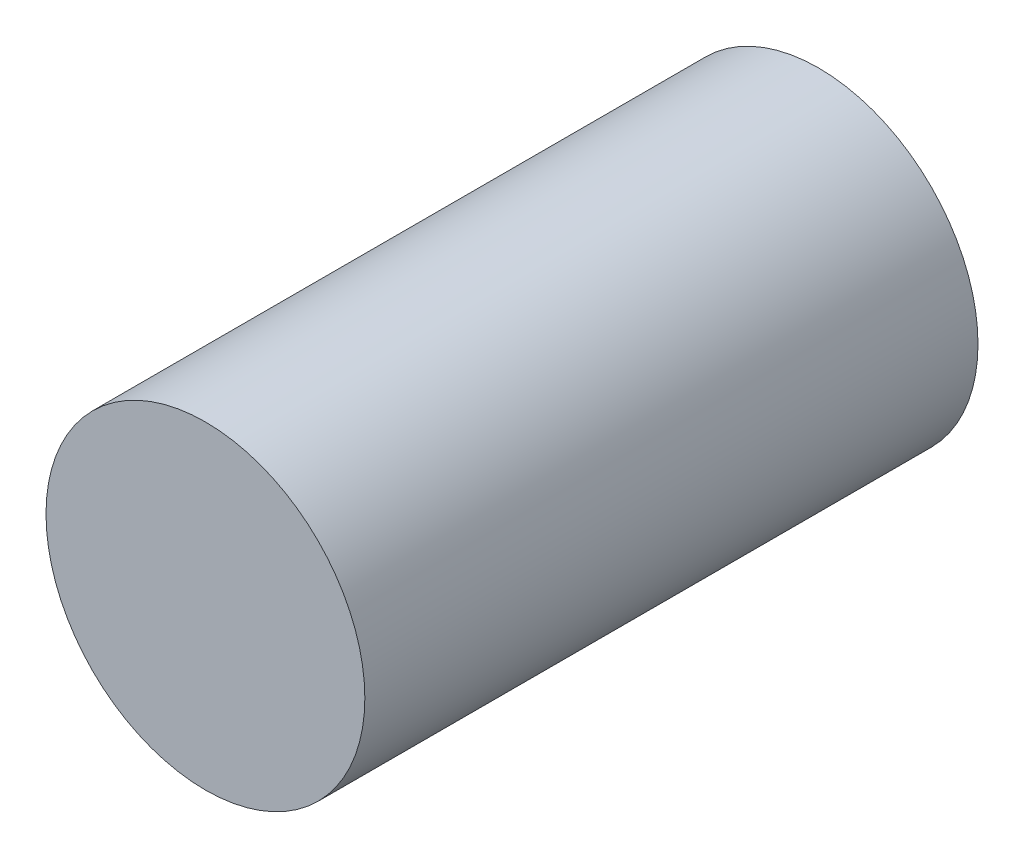
ISO-10303-21;
HEADER;
FILE_DESCRIPTION(('STEP AP214'),'2;1');
FILE_NAME('part.step','',(''),(''),'','','');
FILE_SCHEMA(('AUTOMOTIVE_DESIGN { 1 0 10303 214 1 1 1 1 }'));
ENDSEC;
DATA;
#1=APPLICATION_CONTEXT('core data for automotive mechanical design processes');
#2=APPLICATION_PROTOCOL_DEFINITION('international standard','automotive_design',2000,#1);
#3=PRODUCT_CONTEXT('',#1,'mechanical');
#4=PRODUCT('Part','Part','',(#3));
#5=PRODUCT_RELATED_PRODUCT_CATEGORY('part','',(#4));
#6=PRODUCT_DEFINITION_FORMATION('','',#4);
#7=PRODUCT_DEFINITION_CONTEXT('part definition',#1,'design');
#8=PRODUCT_DEFINITION('design','',#6,#7);
#9=PRODUCT_DEFINITION_SHAPE('','',#8);
#10=(LENGTH_UNIT() NAMED_UNIT(*) SI_UNIT(.MILLI.,.METRE.));
#11=(NAMED_UNIT(*) PLANE_ANGLE_UNIT() SI_UNIT($,.RADIAN.));
#12=(NAMED_UNIT(*) SI_UNIT($,.STERADIAN.) SOLID_ANGLE_UNIT());
#13=UNCERTAINTY_MEASURE_WITH_UNIT(LENGTH_MEASURE(1.E-05),#10,'distance_accuracy_value','');
#14=(GEOMETRIC_REPRESENTATION_CONTEXT(3) GLOBAL_UNCERTAINTY_ASSIGNED_CONTEXT((#13)) GLOBAL_UNIT_ASSIGNED_CONTEXT((#10,
#11,#12)) REPRESENTATION_CONTEXT('',''));
#15=CARTESIAN_POINT('',(0.,0.,0.));
#16=DIRECTION('',(0.,0.,1.));
#17=DIRECTION('',(1.,0.,0.));
#18=AXIS2_PLACEMENT_3D('',#15,#16,#17);
#19=CARTESIAN_POINT('',(0.,0.,50.));
#20=DIRECTION('',(0.,0.,-1.));
#21=DIRECTION('',(-1.,0.,0.));
#22=AXIS2_PLACEMENT_3D('',#19,#20,#21);
#23=CYLINDRICAL_SURFACE('',#22,13.);
#24=CARTESIAN_POINT('',(0.,0.,50.));
#25=DIRECTION('',(0.,0.,1.));
#26=DIRECTION('',(1.,0.,0.));
#27=AXIS2_PLACEMENT_3D('',#24,#25,#26);
#28=CIRCLE('',#27,13.);
#29=CARTESIAN_POINT('',(13.,0.,50.));
#30=VERTEX_POINT('',#29);
#31=EDGE_CURVE('E10',#30,#30,#28,.T.);
#32=ORIENTED_EDGE('',*,*,#31,.F.);
#33=EDGE_LOOP('',(#32));
#34=FACE_BOUND('',#33,.T.);
#35=CARTESIAN_POINT('',(0.,0.,0.));
#36=DIRECTION('',(0.,0.,1.));
#37=DIRECTION('',(1.,0.,0.));
#38=AXIS2_PLACEMENT_3D('',#35,#36,#37);
#39=CIRCLE('',#38,13.);
#40=CARTESIAN_POINT('',(13.,0.,0.));
#41=VERTEX_POINT('',#40);
#42=EDGE_CURVE('E38',#41,#41,#39,.T.);
#43=ORIENTED_EDGE('',*,*,#42,.T.);
#44=EDGE_LOOP('',(#43));
#45=FACE_BOUND('',#44,.T.);
#46=ADVANCED_FACE('F35',(#34,#45),#23,.T.);
#47=CARTESIAN_POINT('',(0.,0.,50.));
#48=DIRECTION('',(0.,0.,1.));
#49=DIRECTION('',(1.,0.,0.));
#50=AXIS2_PLACEMENT_3D('',#47,#48,#49);
#51=PLANE('',#50);
#52=ORIENTED_EDGE('',*,*,#31,.T.);
#53=EDGE_LOOP('',(#52));
#54=FACE_BOUND('',#53,.T.);
#55=ADVANCED_FACE('F50',(#54),#51,.T.);
#56=CARTESIAN_POINT('',(0.,0.,0.));
#57=DIRECTION('',(0.,0.,1.));
#58=DIRECTION('',(1.,0.,0.));
#59=AXIS2_PLACEMENT_3D('',#56,#57,#58);
#60=PLANE('',#59);
#61=ORIENTED_EDGE('',*,*,#42,.F.);
#62=EDGE_LOOP('',(#61));
#63=FACE_BOUND('',#62,.T.);
#64=ADVANCED_FACE('F48',(#63),#60,.F.);
#65=CLOSED_SHELL('',(#46,#55,#64));
#66=MANIFOLD_SOLID_BREP('B2',#65);
#67=ADVANCED_BREP_SHAPE_REPRESENTATION('',(#18,#66),#14);
#68=SHAPE_DEFINITION_REPRESENTATION(#9,#67);
ENDSEC;
END-ISO-10303-21;
